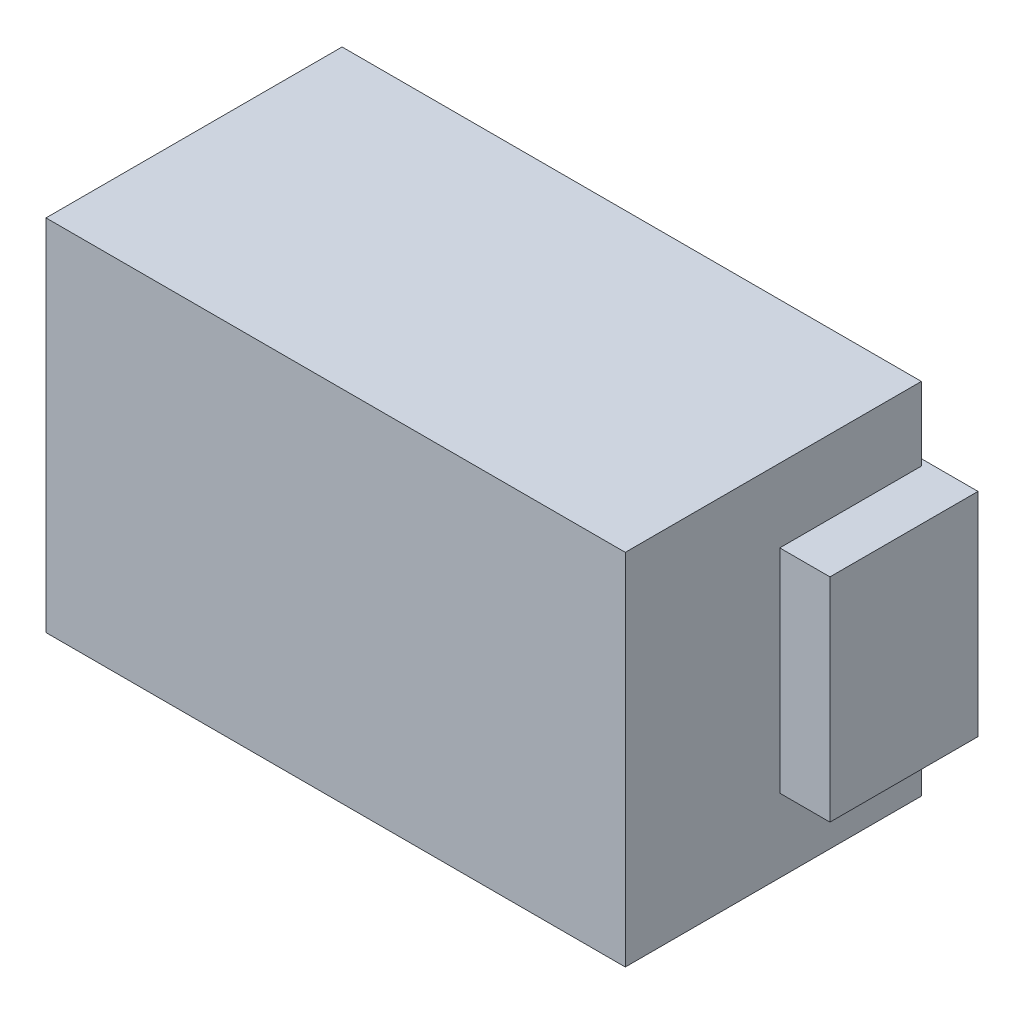
ISO-10303-21;
HEADER;
FILE_DESCRIPTION(('STEP AP214'),'2;1');
FILE_NAME('part.step','',(''),(''),'','','');
FILE_SCHEMA(('AUTOMOTIVE_DESIGN { 1 0 10303 214 1 1 1 1 }'));
ENDSEC;
DATA;
#1=APPLICATION_CONTEXT('core data for automotive mechanical design processes');
#2=APPLICATION_PROTOCOL_DEFINITION('international standard','automotive_design',2000,#1);
#3=PRODUCT_CONTEXT('',#1,'mechanical');
#4=PRODUCT('Part','Part','',(#3));
#5=PRODUCT_RELATED_PRODUCT_CATEGORY('part','',(#4));
#6=PRODUCT_DEFINITION_FORMATION('','',#4);
#7=PRODUCT_DEFINITION_CONTEXT('part definition',#1,'design');
#8=PRODUCT_DEFINITION('design','',#6,#7);
#9=PRODUCT_DEFINITION_SHAPE('','',#8);
#10=(LENGTH_UNIT() NAMED_UNIT(*) SI_UNIT(.MILLI.,.METRE.));
#11=(NAMED_UNIT(*) PLANE_ANGLE_UNIT() SI_UNIT($,.RADIAN.));
#12=(NAMED_UNIT(*) SI_UNIT($,.STERADIAN.) SOLID_ANGLE_UNIT());
#13=UNCERTAINTY_MEASURE_WITH_UNIT(LENGTH_MEASURE(1.E-05),#10,'distance_accuracy_value','');
#14=(GEOMETRIC_REPRESENTATION_CONTEXT(3) GLOBAL_UNCERTAINTY_ASSIGNED_CONTEXT((#13)) GLOBAL_UNIT_ASSIGNED_CONTEXT((#10,
#11,#12)) REPRESENTATION_CONTEXT('',''));
#15=CARTESIAN_POINT('',(0.,0.,0.));
#16=DIRECTION('',(0.,0.,1.));
#17=DIRECTION('',(1.,0.,0.));
#18=AXIS2_PLACEMENT_3D('',#15,#16,#17);
#19=CARTESIAN_POINT('',(-1.12000002991408,0.,0.));
#20=DIRECTION('',(1.,0.,0.));
#21=DIRECTION('',(0.,0.,-1.));
#22=AXIS2_PLACEMENT_3D('',#19,#20,#21);
#23=PLANE('',#22);
#24=DIRECTION('',(0.,0.,-1.));
#25=VECTOR('',#24,1.);
#26=CARTESIAN_POINT('',(-1.12000002991408,0.824999995529652,1.15000002551824));
#27=LINE('',#26,#25);
#28=CARTESIAN_POINT('',(-1.12000002991408,0.824999995529652,1.15000002551824));
#29=VERTEX_POINT('',#28);
#30=CARTESIAN_POINT('',(-1.12000002991408,0.824999995529652,0.));
#31=VERTEX_POINT('',#30);
#32=EDGE_CURVE('P0_E63',#29,#31,#27,.T.);
#33=ORIENTED_EDGE('',*,*,#32,.F.);
#34=DIRECTION('',(0.,1.,0.));
#35=VECTOR('',#34,1.);
#36=CARTESIAN_POINT('',(-1.12000002991408,-0.824999995529652,1.15000002551824));
#37=LINE('',#36,#35);
#38=CARTESIAN_POINT('',(-1.12000002991408,-0.824999995529652,1.15000002551824));
#39=VERTEX_POINT('',#38);
#40=EDGE_CURVE('P0_E53',#39,#29,#37,.T.);
#41=ORIENTED_EDGE('',*,*,#40,.F.);
#42=DIRECTION('',(0.,0.,1.));
#43=VECTOR('',#42,1.);
#44=CARTESIAN_POINT('',(-1.12000002991408,-0.824999995529652,0.));
#45=LINE('',#44,#43);
#46=CARTESIAN_POINT('',(-1.12000002991408,-0.824999995529652,0.));
#47=VERTEX_POINT('',#46);
#48=EDGE_CURVE('P0_E19',#47,#39,#45,.T.);
#49=ORIENTED_EDGE('',*,*,#48,.F.);
#50=DIRECTION('',(0.,-1.,0.));
#51=VECTOR('',#50,1.);
#52=CARTESIAN_POINT('',(-1.12000002991408,0.824999995529652,0.));
#53=LINE('',#52,#51);
#54=EDGE_CURVE('P0_E75',#31,#47,#53,.T.);
#55=ORIENTED_EDGE('',*,*,#54,.F.);
#56=EDGE_LOOP('',(#33,#41,#49,#55));
#57=FACE_BOUND('',#56,.T.);
#58=ADVANCED_FACE('P0_F16',(#57),#23,.T.);
#59=CARTESIAN_POINT('',(0.,-0.824999995529652,0.));
#60=DIRECTION('',(0.,-1.,0.));
#61=DIRECTION('',(0.,0.,-1.));
#62=AXIS2_PLACEMENT_3D('',#59,#60,#61);
#63=PLANE('',#62);
#64=DIRECTION('',(1.,0.,0.));
#65=VECTOR('',#64,1.);
#66=CARTESIAN_POINT('',(-2.64000007882714,-0.824999995529652,1.15000002551824));
#67=LINE('',#66,#65);
#68=CARTESIAN_POINT('',(-2.64000007882714,-0.824999995529652,1.15000002551824));
#69=VERTEX_POINT('',#68);
#70=EDGE_CURVE('P0_E57',#69,#39,#67,.T.);
#71=ORIENTED_EDGE('',*,*,#70,.F.);
#72=DIRECTION('',(0.,0.,1.));
#73=VECTOR('',#72,1.);
#74=CARTESIAN_POINT('',(-2.64000007882714,-0.824999995529652,0.));
#75=LINE('',#74,#73);
#76=CARTESIAN_POINT('',(-2.64000007882714,-0.824999995529652,0.));
#77=VERTEX_POINT('',#76);
#78=EDGE_CURVE('P0_E34',#77,#69,#75,.T.);
#79=ORIENTED_EDGE('',*,*,#78,.F.);
#80=DIRECTION('',(-1.,0.,0.));
#81=VECTOR('',#80,1.);
#82=CARTESIAN_POINT('',(-1.12000002991408,-0.824999995529652,0.));
#83=LINE('',#82,#81);
#84=EDGE_CURVE('P0_E59',#47,#77,#83,.T.);
#85=ORIENTED_EDGE('',*,*,#84,.F.);
#86=ORIENTED_EDGE('',*,*,#48,.T.);
#87=EDGE_LOOP('',(#71,#79,#85,#86));
#88=FACE_BOUND('',#87,.T.);
#89=ADVANCED_FACE('P0_F56',(#88),#63,.T.);
#90=CARTESIAN_POINT('',(0.,0.,1.15000002551824));
#91=DIRECTION('',(0.,0.,1.));
#92=DIRECTION('',(1.,0.,0.));
#93=AXIS2_PLACEMENT_3D('',#90,#91,#92);
#94=PLANE('',#93);
#95=DIRECTION('',(0.,1.,0.));
#96=VECTOR('',#95,1.);
#97=CARTESIAN_POINT('',(-2.64000007882714,-0.824999995529652,1.15000002551824));
#98=LINE('',#97,#96);
#99=CARTESIAN_POINT('',(-2.64000007882714,0.824999995529652,1.15000002551824));
#100=VERTEX_POINT('',#99);
#101=EDGE_CURVE('P0_E68',#69,#100,#98,.T.);
#102=ORIENTED_EDGE('',*,*,#101,.F.);
#103=ORIENTED_EDGE('',*,*,#70,.T.);
#104=ORIENTED_EDGE('',*,*,#40,.T.);
#105=DIRECTION('',(1.,0.,0.));
#106=VECTOR('',#105,1.);
#107=CARTESIAN_POINT('',(-2.64000007882714,0.824999995529652,1.15000002551824));
#108=LINE('',#107,#106);
#109=EDGE_CURVE('P0_E65',#100,#29,#108,.T.);
#110=ORIENTED_EDGE('',*,*,#109,.F.);
#111=EDGE_LOOP('',(#102,#103,#104,#110));
#112=FACE_BOUND('',#111,.T.);
#113=ADVANCED_FACE('P0_F66',(#112),#94,.T.);
#114=CARTESIAN_POINT('',(0.,0.824999995529652,0.));
#115=DIRECTION('',(0.,1.,0.));
#116=DIRECTION('',(0.,0.,1.));
#117=AXIS2_PLACEMENT_3D('',#114,#115,#116);
#118=PLANE('',#117);
#119=DIRECTION('',(0.,0.,-1.));
#120=VECTOR('',#119,1.);
#121=CARTESIAN_POINT('',(-2.64000007882714,0.824999995529652,1.15000002551824));
#122=LINE('',#121,#120);
#123=CARTESIAN_POINT('',(-2.64000007882714,0.824999995529652,0.));
#124=VERTEX_POINT('',#123);
#125=EDGE_CURVE('P0_E25',#100,#124,#122,.T.);
#126=ORIENTED_EDGE('',*,*,#125,.F.);
#127=ORIENTED_EDGE('',*,*,#109,.T.);
#128=ORIENTED_EDGE('',*,*,#32,.T.);
#129=DIRECTION('',(1.,0.,0.));
#130=VECTOR('',#129,1.);
#131=CARTESIAN_POINT('',(-2.64000007882714,0.824999995529652,0.));
#132=LINE('',#131,#130);
#133=EDGE_CURVE('P0_E74',#124,#31,#132,.T.);
#134=ORIENTED_EDGE('',*,*,#133,.F.);
#135=EDGE_LOOP('',(#126,#127,#128,#134));
#136=FACE_BOUND('',#135,.T.);
#137=ADVANCED_FACE('P0_F87',(#136),#118,.T.);
#138=CARTESIAN_POINT('',(0.,0.,0.));
#139=DIRECTION('',(0.,0.,-1.));
#140=DIRECTION('',(-1.,0.,0.));
#141=AXIS2_PLACEMENT_3D('',#138,#139,#140);
#142=PLANE('',#141);
#143=ORIENTED_EDGE('',*,*,#84,.T.);
#144=DIRECTION('',(0.,-1.,0.));
#145=VECTOR('',#144,1.);
#146=CARTESIAN_POINT('',(-2.64000007882714,0.824999995529652,0.));
#147=LINE('',#146,#145);
#148=EDGE_CURVE('P0_E10',#124,#77,#147,.T.);
#149=ORIENTED_EDGE('',*,*,#148,.F.);
#150=ORIENTED_EDGE('',*,*,#133,.T.);
#151=ORIENTED_EDGE('',*,*,#54,.T.);
#152=EDGE_LOOP('',(#143,#149,#150,#151));
#153=FACE_BOUND('',#152,.T.);
#154=ADVANCED_FACE('P0_F90',(#153),#142,.T.);
#155=CARTESIAN_POINT('',(-2.64000007882714,0.,0.));
#156=DIRECTION('',(-1.,0.,0.));
#157=DIRECTION('',(0.,0.,1.));
#158=AXIS2_PLACEMENT_3D('',#155,#156,#157);
#159=PLANE('',#158);
#160=ORIENTED_EDGE('',*,*,#78,.T.);
#161=ORIENTED_EDGE('',*,*,#101,.T.);
#162=ORIENTED_EDGE('',*,*,#125,.T.);
#163=ORIENTED_EDGE('',*,*,#148,.T.);
#164=EDGE_LOOP('',(#160,#161,#162,#163));
#165=FACE_BOUND('',#164,.T.);
#166=ADVANCED_FACE('P0_F83',(#165),#159,.T.);
#167=CLOSED_SHELL('',(#58,#89,#113,#137,#154,#166));
#168=MANIFOLD_SOLID_BREP('P0_B1',#167);
#169=CARTESIAN_POINT('',(0.,-1.39500002842396,0.));
#170=DIRECTION('',(0.,-1.,0.));
#171=DIRECTION('',(0.,0.,-1.));
#172=AXIS2_PLACEMENT_3D('',#169,#170,#171);
#173=PLANE('',#172);
#174=DIRECTION('',(0.,0.,-1.));
#175=VECTOR('',#174,1.);
#176=CARTESIAN_POINT('',(2.24999990314245,-1.39500002842396,2.34999996609986));
#177=LINE('',#176,#175);
#178=CARTESIAN_POINT('',(2.24999990314245,-1.39500002842396,2.34999996609986));
#179=VERTEX_POINT('',#178);
#180=CARTESIAN_POINT('',(2.24999990314245,-1.39500002842396,0.0500000023748726));
#181=VERTEX_POINT('',#180);
#182=EDGE_CURVE('P1_E62',#179,#181,#177,.T.);
#183=ORIENTED_EDGE('',*,*,#182,.F.);
#184=DIRECTION('',(1.,0.,0.));
#185=VECTOR('',#184,1.);
#186=CARTESIAN_POINT('',(1.79999996908009,-1.39500002842396,2.34999996609986));
#187=LINE('',#186,#185);
#188=CARTESIAN_POINT('',(-2.24999990314245,-1.39500002842396,2.34999996609986));
#189=VERTEX_POINT('',#188);
#190=EDGE_CURVE('P1_E59',#189,#179,#187,.T.);
#191=ORIENTED_EDGE('',*,*,#190,.F.);
#192=DIRECTION('',(0.,0.,1.));
#193=VECTOR('',#192,1.);
#194=CARTESIAN_POINT('',(-2.24999990314245,-1.39500002842396,0.0500000023748726));
#195=LINE('',#194,#193);
#196=CARTESIAN_POINT('',(-2.24999990314245,-1.39500002842396,0.0500000023748726));
#197=VERTEX_POINT('',#196);
#198=EDGE_CURVE('P1_E20',#197,#189,#195,.T.);
#199=ORIENTED_EDGE('',*,*,#198,.F.);
#200=DIRECTION('',(-1.,0.,0.));
#201=VECTOR('',#200,1.);
#202=CARTESIAN_POINT('',(2.24999990314245,-1.39500002842396,0.0500000023748726));
#203=LINE('',#202,#201);
#204=EDGE_CURVE('P1_E54',#181,#197,#203,.T.);
#205=ORIENTED_EDGE('',*,*,#204,.F.);
#206=EDGE_LOOP('',(#183,#191,#199,#205));
#207=FACE_BOUND('',#206,.T.);
#208=ADVANCED_FACE('P1_F17',(#207),#173,.T.);
#209=CARTESIAN_POINT('',(-2.24999990314245,0.,0.));
#210=DIRECTION('',(-1.,0.,0.));
#211=DIRECTION('',(0.,0.,1.));
#212=AXIS2_PLACEMENT_3D('',#209,#210,#211);
#213=PLANE('',#212);
#214=ORIENTED_EDGE('',*,*,#198,.T.);
#215=DIRECTION('',(0.,-1.,0.));
#216=VECTOR('',#215,1.);
#217=CARTESIAN_POINT('',(-2.24999990314245,1.39500002842396,2.34999996609986));
#218=LINE('',#217,#216);
#219=CARTESIAN_POINT('',(-2.24999990314245,1.39500002842396,2.34999996609986));
#220=VERTEX_POINT('',#219);
#221=EDGE_CURVE('P1_E73',#220,#189,#218,.T.);
#222=ORIENTED_EDGE('',*,*,#221,.F.);
#223=DIRECTION('',(0.,0.,1.));
#224=VECTOR('',#223,1.);
#225=CARTESIAN_POINT('',(-2.24999990314245,1.39500002842396,0.0500000023748726));
#226=LINE('',#225,#224);
#227=CARTESIAN_POINT('',(-2.24999990314245,1.39500002842396,0.0500000023748726));
#228=VERTEX_POINT('',#227);
#229=EDGE_CURVE('P1_E83',#228,#220,#226,.T.);
#230=ORIENTED_EDGE('',*,*,#229,.F.);
#231=DIRECTION('',(0.,1.,0.));
#232=VECTOR('',#231,1.);
#233=CARTESIAN_POINT('',(-2.24999990314245,-1.39500002842396,0.0500000023748726));
#234=LINE('',#233,#232);
#235=EDGE_CURVE('P1_E67',#197,#228,#234,.T.);
#236=ORIENTED_EDGE('',*,*,#235,.F.);
#237=EDGE_LOOP('',(#214,#222,#230,#236));
#238=FACE_BOUND('',#237,.T.);
#239=ADVANCED_FACE('P1_F71',(#238),#213,.T.);
#240=CARTESIAN_POINT('',(0.,0.,2.34999996609986));
#241=DIRECTION('',(0.,0.,1.));
#242=DIRECTION('',(1.,0.,0.));
#243=AXIS2_PLACEMENT_3D('',#240,#241,#242);
#244=PLANE('',#243);
#245=DIRECTION('',(0.,-1.,0.));
#246=VECTOR('',#245,1.);
#247=CARTESIAN_POINT('',(2.24999990314245,1.39500002842396,2.34999996609986));
#248=LINE('',#247,#246);
#249=CARTESIAN_POINT('',(2.24999990314245,1.39500002842396,2.34999996609986));
#250=VERTEX_POINT('',#249);
#251=EDGE_CURVE('P1_E66',#250,#179,#248,.T.);
#252=ORIENTED_EDGE('',*,*,#251,.F.);
#253=DIRECTION('',(1.,0.,0.));
#254=VECTOR('',#253,1.);
#255=CARTESIAN_POINT('',(1.79999996908009,1.39500002842396,2.34999996609986));
#256=LINE('',#255,#254);
#257=EDGE_CURVE('P1_E77',#220,#250,#256,.T.);
#258=ORIENTED_EDGE('',*,*,#257,.F.);
#259=ORIENTED_EDGE('',*,*,#221,.T.);
#260=ORIENTED_EDGE('',*,*,#190,.T.);
#261=EDGE_LOOP('',(#252,#258,#259,#260));
#262=FACE_BOUND('',#261,.T.);
#263=ADVANCED_FACE('P1_F75',(#262),#244,.T.);
#264=CARTESIAN_POINT('',(2.24999990314245,0.,0.));
#265=DIRECTION('',(1.,0.,0.));
#266=DIRECTION('',(0.,0.,-1.));
#267=AXIS2_PLACEMENT_3D('',#264,#265,#266);
#268=PLANE('',#267);
#269=DIRECTION('',(0.,0.,-1.));
#270=VECTOR('',#269,1.);
#271=CARTESIAN_POINT('',(2.24999990314245,1.39500002842396,2.34999996609986));
#272=LINE('',#271,#270);
#273=CARTESIAN_POINT('',(2.24999990314245,1.39500002842396,0.0500000023748726));
#274=VERTEX_POINT('',#273);
#275=EDGE_CURVE('P1_E26',#250,#274,#272,.T.);
#276=ORIENTED_EDGE('',*,*,#275,.F.);
#277=ORIENTED_EDGE('',*,*,#251,.T.);
#278=ORIENTED_EDGE('',*,*,#182,.T.);
#279=DIRECTION('',(0.,-1.,0.));
#280=VECTOR('',#279,1.);
#281=CARTESIAN_POINT('',(2.24999990314245,1.39500002842396,0.0500000023748726));
#282=LINE('',#281,#280);
#283=EDGE_CURVE('P1_E35',#274,#181,#282,.T.);
#284=ORIENTED_EDGE('',*,*,#283,.F.);
#285=EDGE_LOOP('',(#276,#277,#278,#284));
#286=FACE_BOUND('',#285,.T.);
#287=ADVANCED_FACE('P1_F90',(#286),#268,.T.);
#288=CARTESIAN_POINT('',(0.,0.,0.0500000023748726));
#289=DIRECTION('',(0.,0.,-1.));
#290=DIRECTION('',(-1.,0.,0.));
#291=AXIS2_PLACEMENT_3D('',#288,#289,#290);
#292=PLANE('',#291);
#293=DIRECTION('',(-1.,0.,0.));
#294=VECTOR('',#293,1.);
#295=CARTESIAN_POINT('',(2.24999990314245,1.39500002842396,0.0500000023748726));
#296=LINE('',#295,#294);
#297=EDGE_CURVE('P1_E11',#274,#228,#296,.T.);
#298=ORIENTED_EDGE('',*,*,#297,.F.);
#299=ORIENTED_EDGE('',*,*,#283,.T.);
#300=ORIENTED_EDGE('',*,*,#204,.T.);
#301=ORIENTED_EDGE('',*,*,#235,.T.);
#302=EDGE_LOOP('',(#298,#299,#300,#301));
#303=FACE_BOUND('',#302,.T.);
#304=ADVANCED_FACE('P1_F91',(#303),#292,.T.);
#305=CARTESIAN_POINT('',(0.,1.39500002842396,0.));
#306=DIRECTION('',(0.,1.,0.));
#307=DIRECTION('',(0.,0.,1.));
#308=AXIS2_PLACEMENT_3D('',#305,#306,#307);
#309=PLANE('',#308);
#310=ORIENTED_EDGE('',*,*,#257,.T.);
#311=ORIENTED_EDGE('',*,*,#275,.T.);
#312=ORIENTED_EDGE('',*,*,#297,.T.);
#313=ORIENTED_EDGE('',*,*,#229,.T.);
#314=EDGE_LOOP('',(#310,#311,#312,#313));
#315=FACE_BOUND('',#314,.T.);
#316=ADVANCED_FACE('P1_F89',(#315),#309,.T.);
#317=CLOSED_SHELL('',(#208,#239,#263,#287,#304,#316));
#318=MANIFOLD_SOLID_BREP('P1_B1',#317);
#319=CARTESIAN_POINT('',(2.64000007882714,0.,0.));
#320=DIRECTION('',(1.,0.,0.));
#321=DIRECTION('',(0.,0.,-1.));
#322=AXIS2_PLACEMENT_3D('',#319,#320,#321);
#323=PLANE('',#322);
#324=DIRECTION('',(0.,0.,-1.));
#325=VECTOR('',#324,1.);
#326=CARTESIAN_POINT('',(2.64000007882714,0.824999995529652,1.15000002551824));
#327=LINE('',#326,#325);
#328=CARTESIAN_POINT('',(2.64000007882714,0.824999995529652,1.15000002551824));
#329=VERTEX_POINT('',#328);
#330=CARTESIAN_POINT('',(2.64000007882714,0.824999995529652,0.));
#331=VERTEX_POINT('',#330);
#332=EDGE_CURVE('P2_E64',#329,#331,#327,.T.);
#333=ORIENTED_EDGE('',*,*,#332,.F.);
#334=DIRECTION('',(0.,1.,0.));
#335=VECTOR('',#334,1.);
#336=CARTESIAN_POINT('',(2.64000007882714,-0.824999995529652,1.15000002551824));
#337=LINE('',#336,#335);
#338=CARTESIAN_POINT('',(2.64000007882714,-0.824999995529652,1.15000002551824));
#339=VERTEX_POINT('',#338);
#340=EDGE_CURVE('P2_E54',#339,#329,#337,.T.);
#341=ORIENTED_EDGE('',*,*,#340,.F.);
#342=DIRECTION('',(0.,0.,1.));
#343=VECTOR('',#342,1.);
#344=CARTESIAN_POINT('',(2.64000007882714,-0.824999995529652,0.));
#345=LINE('',#344,#343);
#346=CARTESIAN_POINT('',(2.64000007882714,-0.824999995529652,0.));
#347=VERTEX_POINT('',#346);
#348=EDGE_CURVE('P2_E20',#347,#339,#345,.T.);
#349=ORIENTED_EDGE('',*,*,#348,.F.);
#350=DIRECTION('',(0.,-1.,0.));
#351=VECTOR('',#350,1.);
#352=CARTESIAN_POINT('',(2.64000007882714,0.824999995529652,0.));
#353=LINE('',#352,#351);
#354=EDGE_CURVE('P2_E76',#331,#347,#353,.T.);
#355=ORIENTED_EDGE('',*,*,#354,.F.);
#356=EDGE_LOOP('',(#333,#341,#349,#355));
#357=FACE_BOUND('',#356,.T.);
#358=ADVANCED_FACE('P2_F17',(#357),#323,.T.);
#359=CARTESIAN_POINT('',(0.,-0.824999995529652,0.));
#360=DIRECTION('',(0.,-1.,0.));
#361=DIRECTION('',(0.,0.,-1.));
#362=AXIS2_PLACEMENT_3D('',#359,#360,#361);
#363=PLANE('',#362);
#364=DIRECTION('',(1.,0.,0.));
#365=VECTOR('',#364,1.);
#366=CARTESIAN_POINT('',(1.12000002991408,-0.824999995529652,1.15000002551824));
#367=LINE('',#366,#365);
#368=CARTESIAN_POINT('',(1.12000002991408,-0.824999995529652,1.15000002551824));
#369=VERTEX_POINT('',#368);
#370=EDGE_CURVE('P2_E58',#369,#339,#367,.T.);
#371=ORIENTED_EDGE('',*,*,#370,.F.);
#372=DIRECTION('',(0.,0.,1.));
#373=VECTOR('',#372,1.);
#374=CARTESIAN_POINT('',(1.12000002991408,-0.824999995529652,0.));
#375=LINE('',#374,#373);
#376=CARTESIAN_POINT('',(1.12000002991408,-0.824999995529652,0.));
#377=VERTEX_POINT('',#376);
#378=EDGE_CURVE('P2_E35',#377,#369,#375,.T.);
#379=ORIENTED_EDGE('',*,*,#378,.F.);
#380=DIRECTION('',(-1.,0.,0.));
#381=VECTOR('',#380,1.);
#382=CARTESIAN_POINT('',(2.64000007882714,-0.824999995529652,0.));
#383=LINE('',#382,#381);
#384=EDGE_CURVE('P2_E60',#347,#377,#383,.T.);
#385=ORIENTED_EDGE('',*,*,#384,.F.);
#386=ORIENTED_EDGE('',*,*,#348,.T.);
#387=EDGE_LOOP('',(#371,#379,#385,#386));
#388=FACE_BOUND('',#387,.T.);
#389=ADVANCED_FACE('P2_F57',(#388),#363,.T.);
#390=CARTESIAN_POINT('',(0.,0.,1.15000002551824));
#391=DIRECTION('',(0.,0.,1.));
#392=DIRECTION('',(1.,0.,0.));
#393=AXIS2_PLACEMENT_3D('',#390,#391,#392);
#394=PLANE('',#393);
#395=DIRECTION('',(0.,1.,0.));
#396=VECTOR('',#395,1.);
#397=CARTESIAN_POINT('',(1.12000002991408,-0.824999995529652,1.15000002551824));
#398=LINE('',#397,#396);
#399=CARTESIAN_POINT('',(1.12000002991408,0.824999995529652,1.15000002551824));
#400=VERTEX_POINT('',#399);
#401=EDGE_CURVE('P2_E69',#369,#400,#398,.T.);
#402=ORIENTED_EDGE('',*,*,#401,.F.);
#403=ORIENTED_EDGE('',*,*,#370,.T.);
#404=ORIENTED_EDGE('',*,*,#340,.T.);
#405=DIRECTION('',(1.,0.,0.));
#406=VECTOR('',#405,1.);
#407=CARTESIAN_POINT('',(1.12000002991408,0.824999995529652,1.15000002551824));
#408=LINE('',#407,#406);
#409=EDGE_CURVE('P2_E66',#400,#329,#408,.T.);
#410=ORIENTED_EDGE('',*,*,#409,.F.);
#411=EDGE_LOOP('',(#402,#403,#404,#410));
#412=FACE_BOUND('',#411,.T.);
#413=ADVANCED_FACE('P2_F67',(#412),#394,.T.);
#414=CARTESIAN_POINT('',(0.,0.824999995529652,0.));
#415=DIRECTION('',(0.,1.,0.));
#416=DIRECTION('',(0.,0.,1.));
#417=AXIS2_PLACEMENT_3D('',#414,#415,#416);
#418=PLANE('',#417);
#419=DIRECTION('',(0.,0.,-1.));
#420=VECTOR('',#419,1.);
#421=CARTESIAN_POINT('',(1.12000002991408,0.824999995529652,1.15000002551824));
#422=LINE('',#421,#420);
#423=CARTESIAN_POINT('',(1.12000002991408,0.824999995529652,0.));
#424=VERTEX_POINT('',#423);
#425=EDGE_CURVE('P2_E26',#400,#424,#422,.T.);
#426=ORIENTED_EDGE('',*,*,#425,.F.);
#427=ORIENTED_EDGE('',*,*,#409,.T.);
#428=ORIENTED_EDGE('',*,*,#332,.T.);
#429=DIRECTION('',(1.,0.,0.));
#430=VECTOR('',#429,1.);
#431=CARTESIAN_POINT('',(1.12000002991408,0.824999995529652,0.));
#432=LINE('',#431,#430);
#433=EDGE_CURVE('P2_E75',#424,#331,#432,.T.);
#434=ORIENTED_EDGE('',*,*,#433,.F.);
#435=EDGE_LOOP('',(#426,#427,#428,#434));
#436=FACE_BOUND('',#435,.T.);
#437=ADVANCED_FACE('P2_F88',(#436),#418,.T.);
#438=CARTESIAN_POINT('',(0.,0.,0.));
#439=DIRECTION('',(0.,0.,-1.));
#440=DIRECTION('',(-1.,0.,0.));
#441=AXIS2_PLACEMENT_3D('',#438,#439,#440);
#442=PLANE('',#441);
#443=ORIENTED_EDGE('',*,*,#384,.T.);
#444=DIRECTION('',(0.,-1.,0.));
#445=VECTOR('',#444,1.);
#446=CARTESIAN_POINT('',(1.12000002991408,0.824999995529652,0.));
#447=LINE('',#446,#445);
#448=EDGE_CURVE('P2_E11',#424,#377,#447,.T.);
#449=ORIENTED_EDGE('',*,*,#448,.F.);
#450=ORIENTED_EDGE('',*,*,#433,.T.);
#451=ORIENTED_EDGE('',*,*,#354,.T.);
#452=EDGE_LOOP('',(#443,#449,#450,#451));
#453=FACE_BOUND('',#452,.T.);
#454=ADVANCED_FACE('P2_F91',(#453),#442,.T.);
#455=CARTESIAN_POINT('',(1.12000002991408,0.,0.));
#456=DIRECTION('',(-1.,0.,0.));
#457=DIRECTION('',(0.,0.,1.));
#458=AXIS2_PLACEMENT_3D('',#455,#456,#457);
#459=PLANE('',#458);
#460=ORIENTED_EDGE('',*,*,#378,.T.);
#461=ORIENTED_EDGE('',*,*,#401,.T.);
#462=ORIENTED_EDGE('',*,*,#425,.T.);
#463=ORIENTED_EDGE('',*,*,#448,.T.);
#464=EDGE_LOOP('',(#460,#461,#462,#463));
#465=FACE_BOUND('',#464,.T.);
#466=ADVANCED_FACE('P2_F84',(#465),#459,.T.);
#467=CLOSED_SHELL('',(#358,#389,#413,#437,#454,#466));
#468=MANIFOLD_SOLID_BREP('P2_B1',#467);
#469=ADVANCED_BREP_SHAPE_REPRESENTATION('',(#18,#168,#318,#468),#14);
#470=SHAPE_DEFINITION_REPRESENTATION(#9,#469);
ENDSEC;
END-ISO-10303-21;
